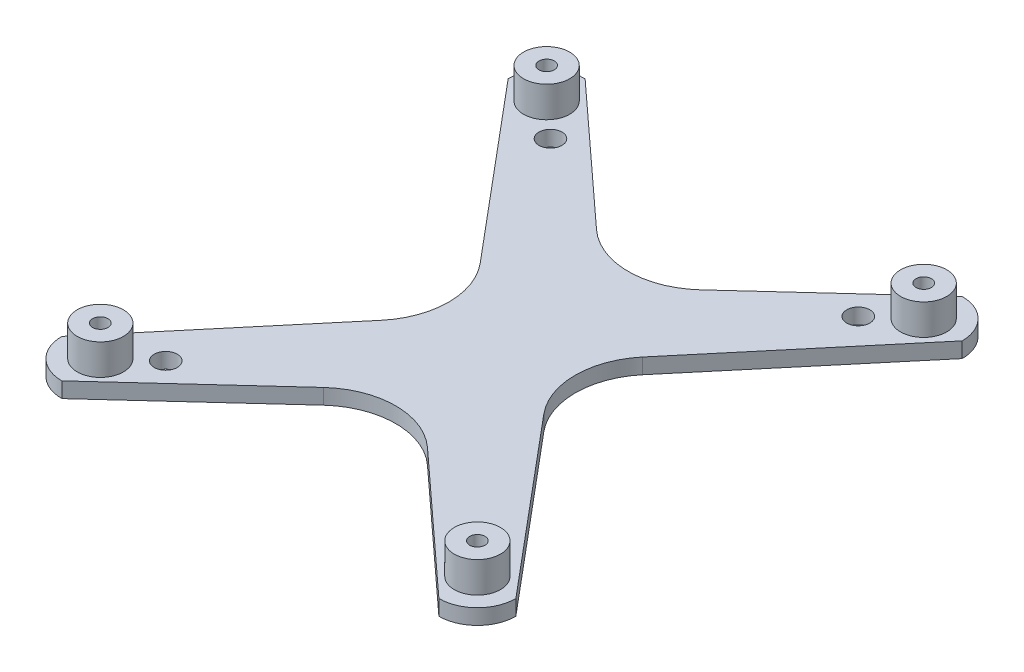
ISO-10303-21;
HEADER;
FILE_DESCRIPTION(('STEP AP214'),'2;1');
FILE_NAME('part.step','',(''),(''),'','','');
FILE_SCHEMA(('AUTOMOTIVE_DESIGN { 1 0 10303 214 1 1 1 1 }'));
ENDSEC;
DATA;
#1=APPLICATION_CONTEXT('core data for automotive mechanical design processes');
#2=APPLICATION_PROTOCOL_DEFINITION('international standard','automotive_design',2000,#1);
#3=PRODUCT_CONTEXT('',#1,'mechanical');
#4=PRODUCT('Part','Part','',(#3));
#5=PRODUCT_RELATED_PRODUCT_CATEGORY('part','',(#4));
#6=PRODUCT_DEFINITION_FORMATION('','',#4);
#7=PRODUCT_DEFINITION_CONTEXT('part definition',#1,'design');
#8=PRODUCT_DEFINITION('design','',#6,#7);
#9=PRODUCT_DEFINITION_SHAPE('','',#8);
#10=(LENGTH_UNIT() NAMED_UNIT(*) SI_UNIT(.MILLI.,.METRE.));
#11=(NAMED_UNIT(*) PLANE_ANGLE_UNIT() SI_UNIT($,.RADIAN.));
#12=(NAMED_UNIT(*) SI_UNIT($,.STERADIAN.) SOLID_ANGLE_UNIT());
#13=UNCERTAINTY_MEASURE_WITH_UNIT(LENGTH_MEASURE(1.E-05),#10,'distance_accuracy_value','');
#14=(GEOMETRIC_REPRESENTATION_CONTEXT(3) GLOBAL_UNCERTAINTY_ASSIGNED_CONTEXT((#13)) GLOBAL_UNIT_ASSIGNED_CONTEXT((#10,
#11,#12)) REPRESENTATION_CONTEXT('',''));
#15=CARTESIAN_POINT('',(0.,0.,0.));
#16=DIRECTION('',(0.,0.,1.));
#17=DIRECTION('',(1.,0.,0.));
#18=AXIS2_PLACEMENT_3D('',#15,#16,#17);
#19=CARTESIAN_POINT('',(0.,2.,0.));
#20=DIRECTION('',(0.,-1.,0.));
#21=DIRECTION('',(0.,0.,-1.));
#22=AXIS2_PLACEMENT_3D('',#19,#20,#21);
#23=PLANE('',#22);
#24=CARTESIAN_POINT('',(54.,2.,-5.));
#25=DIRECTION('',(0.,-1.,0.));
#26=DIRECTION('',(0.,0.,-1.));
#27=AXIS2_PLACEMENT_3D('',#24,#25,#26);
#28=CIRCLE('',#27,3.);
#29=CARTESIAN_POINT('',(54.,2.,-8.));
#30=VERTEX_POINT('',#29);
#31=EDGE_CURVE('E41',#30,#30,#28,.F.);
#32=ORIENTED_EDGE('',*,*,#31,.F.);
#33=EDGE_LOOP('',(#32));
#34=FACE_BOUND('',#33,.T.);
#35=CARTESIAN_POINT('',(9.49999999999998,2.,-8.99999999999999));
#36=DIRECTION('',(0.,1.,0.));
#37=DIRECTION('',(0.,0.,1.));
#38=AXIS2_PLACEMENT_3D('',#35,#36,#37);
#39=CIRCLE('',#38,1.5);
#40=CARTESIAN_POINT('',(9.49999999999998,2.,-7.5));
#41=VERTEX_POINT('',#40);
#42=EDGE_CURVE('E217',#41,#41,#39,.T.);
#43=ORIENTED_EDGE('',*,*,#42,.F.);
#44=EDGE_LOOP('',(#43));
#45=FACE_BOUND('',#44,.T.);
#46=CARTESIAN_POINT('',(49.5,2.,-8.99999999999999));
#47=DIRECTION('',(0.,1.,0.));
#48=DIRECTION('',(0.,0.,1.));
#49=AXIS2_PLACEMENT_3D('',#46,#47,#48);
#50=CIRCLE('',#49,1.5);
#51=CARTESIAN_POINT('',(49.5,2.,-7.49999999999999));
#52=VERTEX_POINT('',#51);
#53=EDGE_CURVE('E221',#52,#52,#50,.T.);
#54=ORIENTED_EDGE('',*,*,#53,.F.);
#55=EDGE_LOOP('',(#54));
#56=FACE_BOUND('',#55,.T.);
#57=CARTESIAN_POINT('',(9.49999999999997,2.,-59.));
#58=DIRECTION('',(0.,1.,0.));
#59=DIRECTION('',(0.,0.,1.));
#60=AXIS2_PLACEMENT_3D('',#57,#58,#59);
#61=CIRCLE('',#60,1.5);
#62=CARTESIAN_POINT('',(9.49999999999997,2.,-57.5));
#63=VERTEX_POINT('',#62);
#64=EDGE_CURVE('E225',#63,#63,#61,.T.);
#65=ORIENTED_EDGE('',*,*,#64,.F.);
#66=EDGE_LOOP('',(#65));
#67=FACE_BOUND('',#66,.T.);
#68=CARTESIAN_POINT('',(49.5,2.,-59.));
#69=DIRECTION('',(0.,1.,0.));
#70=DIRECTION('',(0.,0.,1.));
#71=AXIS2_PLACEMENT_3D('',#68,#69,#70);
#72=CIRCLE('',#71,1.5);
#73=CARTESIAN_POINT('',(49.5,2.,-57.5));
#74=VERTEX_POINT('',#73);
#75=EDGE_CURVE('E229',#74,#74,#72,.T.);
#76=ORIENTED_EDGE('',*,*,#75,.F.);
#77=EDGE_LOOP('',(#76));
#78=FACE_BOUND('',#77,.T.);
#79=CARTESIAN_POINT('',(5.,2.,-63.));
#80=DIRECTION('',(0.,-1.,0.));
#81=DIRECTION('',(0.,0.,-1.));
#82=AXIS2_PLACEMENT_3D('',#79,#80,#81);
#83=CIRCLE('',#82,5.);
#84=CARTESIAN_POINT('',(5.,2.,-68.));
#85=VERTEX_POINT('',#84);
#86=CARTESIAN_POINT('',(0.,2.,-63.));
#87=VERTEX_POINT('',#86);
#88=EDGE_CURVE('E197',#85,#87,#83,.F.);
#89=ORIENTED_EDGE('',*,*,#88,.T.);
#90=DIRECTION('',(-0.642787609686541,0.,-0.766044443118977));
#91=VECTOR('',#90,1.);
#92=CARTESIAN_POINT('',(18.9402608420081,2.,-40.4278760968655));
#93=LINE('',#92,#91);
#94=CARTESIAN_POINT('',(18.9402608420081,2.,-40.4278760968655));
#95=VERTEX_POINT('',#94);
#96=EDGE_CURVE('E394',#95,#87,#93,.T.);
#97=ORIENTED_EDGE('',*,*,#96,.F.);
#98=CARTESIAN_POINT('',(11.2798164108184,2.,-34.));
#99=DIRECTION('',(0.,1.,0.));
#100=DIRECTION('',(0.,0.,1.));
#101=AXIS2_PLACEMENT_3D('',#98,#99,#100);
#102=CIRCLE('',#101,10.);
#103=CARTESIAN_POINT('',(18.9402608420081,2.,-27.5721239031345));
#104=VERTEX_POINT('',#103);
#105=EDGE_CURVE('E402',#104,#95,#102,.T.);
#106=ORIENTED_EDGE('',*,*,#105,.F.);
#107=DIRECTION('',(0.642787609686541,0.,-0.766044443118977));
#108=VECTOR('',#107,1.);
#109=CARTESIAN_POINT('',(0.,2.,-5.));
#110=LINE('',#109,#108);
#111=CARTESIAN_POINT('',(0.,2.,-5.));
#112=VERTEX_POINT('',#111);
#113=EDGE_CURVE('E387',#112,#104,#110,.T.);
#114=ORIENTED_EDGE('',*,*,#113,.F.);
#115=CARTESIAN_POINT('',(5.,2.,-5.));
#116=DIRECTION('',(0.,-1.,0.));
#117=DIRECTION('',(0.,0.,-1.));
#118=AXIS2_PLACEMENT_3D('',#115,#116,#117);
#119=CIRCLE('',#118,5.);
#120=CARTESIAN_POINT('',(5.,2.,0.));
#121=VERTEX_POINT('',#120);
#122=EDGE_CURVE('E194',#112,#121,#119,.F.);
#123=ORIENTED_EDGE('',*,*,#122,.T.);
#124=DIRECTION('',(-0.737277336810123,0.,0.675590207615661));
#125=VECTOR('',#124,1.);
#126=CARTESIAN_POINT('',(22.7440979238434,2.,-16.2594700824356));
#127=LINE('',#126,#125);
#128=CARTESIAN_POINT('',(22.7440979238434,2.,-16.2594700824356));
#129=VERTEX_POINT('',#128);
#130=EDGE_CURVE('E422',#129,#121,#127,.T.);
#131=ORIENTED_EDGE('',*,*,#130,.F.);
#132=CARTESIAN_POINT('',(29.5,2.,-8.88669671433437));
#133=DIRECTION('',(0.,1.,0.));
#134=DIRECTION('',(0.,0.,1.));
#135=AXIS2_PLACEMENT_3D('',#132,#133,#134);
#136=CIRCLE('',#135,10.);
#137=CARTESIAN_POINT('',(36.2559020761567,2.,-16.2594700824356));
#138=VERTEX_POINT('',#137);
#139=EDGE_CURVE('E408',#138,#129,#136,.T.);
#140=ORIENTED_EDGE('',*,*,#139,.F.);
#141=DIRECTION('',(-0.737277336810122,0.,-0.675590207615662));
#142=VECTOR('',#141,1.);
#143=CARTESIAN_POINT('',(54.,2.,0.));
#144=LINE('',#143,#142);
#145=CARTESIAN_POINT('',(54.,2.,0.));
#146=VERTEX_POINT('',#145);
#147=EDGE_CURVE('E414',#146,#138,#144,.T.);
#148=ORIENTED_EDGE('',*,*,#147,.F.);
#149=CARTESIAN_POINT('',(54.,2.,-5.));
#150=DIRECTION('',(0.,-1.,0.));
#151=DIRECTION('',(0.,0.,-1.));
#152=AXIS2_PLACEMENT_3D('',#149,#150,#151);
#153=CIRCLE('',#152,5.);
#154=CARTESIAN_POINT('',(59.,2.,-5.));
#155=VERTEX_POINT('',#154);
#156=EDGE_CURVE('E190',#146,#155,#153,.F.);
#157=ORIENTED_EDGE('',*,*,#156,.T.);
#158=DIRECTION('',(0.642787609686541,0.,0.766044443118977));
#159=VECTOR('',#158,1.);
#160=CARTESIAN_POINT('',(59.,2.,-5.));
#161=LINE('',#160,#159);
#162=CARTESIAN_POINT('',(40.0597391579919,2.,-27.5721239031345));
#163=VERTEX_POINT('',#162);
#164=EDGE_CURVE('E48',#163,#155,#161,.T.);
#165=ORIENTED_EDGE('',*,*,#164,.F.);
#166=CARTESIAN_POINT('',(47.7201835891816,2.,-34.));
#167=DIRECTION('',(0.,1.,0.));
#168=DIRECTION('',(0.,0.,-1.));
#169=AXIS2_PLACEMENT_3D('',#166,#167,#168);
#170=CIRCLE('',#169,10.);
#171=CARTESIAN_POINT('',(40.0597391579919,2.,-40.4278760968655));
#172=VERTEX_POINT('',#171);
#173=EDGE_CURVE('E168',#172,#163,#170,.T.);
#174=ORIENTED_EDGE('',*,*,#173,.F.);
#175=DIRECTION('',(-0.642787609686541,0.,0.766044443118977));
#176=VECTOR('',#175,1.);
#177=CARTESIAN_POINT('',(40.0597391579919,2.,-40.4278760968655));
#178=LINE('',#177,#176);
#179=CARTESIAN_POINT('',(59.,2.,-63.));
#180=VERTEX_POINT('',#179);
#181=EDGE_CURVE('E377',#180,#172,#178,.T.);
#182=ORIENTED_EDGE('',*,*,#181,.F.);
#183=CARTESIAN_POINT('',(54.,2.,-63.));
#184=DIRECTION('',(0.,-1.,0.));
#185=DIRECTION('',(0.,0.,-1.));
#186=AXIS2_PLACEMENT_3D('',#183,#184,#185);
#187=CIRCLE('',#186,5.);
#188=CARTESIAN_POINT('',(54.,2.,-68.));
#189=VERTEX_POINT('',#188);
#190=EDGE_CURVE('E192',#180,#189,#187,.F.);
#191=ORIENTED_EDGE('',*,*,#190,.T.);
#192=DIRECTION('',(0.737277336810123,0.,-0.675590207615661));
#193=VECTOR('',#192,1.);
#194=CARTESIAN_POINT('',(54.,2.,-68.));
#195=LINE('',#194,#193);
#196=CARTESIAN_POINT('',(36.2559020761567,2.,-51.7405299175645));
#197=VERTEX_POINT('',#196);
#198=EDGE_CURVE('E56',#197,#189,#195,.T.);
#199=ORIENTED_EDGE('',*,*,#198,.F.);
#200=CARTESIAN_POINT('',(29.5,2.,-59.1133032856657));
#201=DIRECTION('',(0.,1.,0.));
#202=DIRECTION('',(0.,0.,-1.));
#203=AXIS2_PLACEMENT_3D('',#200,#201,#202);
#204=CIRCLE('',#203,10.);
#205=CARTESIAN_POINT('',(22.7440979238434,2.,-51.7405299175645));
#206=VERTEX_POINT('',#205);
#207=EDGE_CURVE('E433',#206,#197,#204,.T.);
#208=ORIENTED_EDGE('',*,*,#207,.F.);
#209=DIRECTION('',(0.737277336810123,0.,0.675590207615661));
#210=VECTOR('',#209,1.);
#211=CARTESIAN_POINT('',(22.7440979238434,2.,-51.7405299175645));
#212=LINE('',#211,#210);
#213=EDGE_CURVE('E441',#85,#206,#212,.T.);
#214=ORIENTED_EDGE('',*,*,#213,.F.);
#215=EDGE_LOOP('',(#89,#97,#106,#114,#123,#131,#140,#148,#157,#165,#174,#182,#191,#199,#208,#214));
#216=FACE_BOUND('',#215,.T.);
#217=CARTESIAN_POINT('',(4.99999999999999,2.,-63.));
#218=DIRECTION('',(0.,1.,0.));
#219=DIRECTION('',(0.,0.,1.));
#220=AXIS2_PLACEMENT_3D('',#217,#218,#219);
#221=CIRCLE('',#220,3.);
#222=CARTESIAN_POINT('',(4.99999999999999,2.,-60.));
#223=VERTEX_POINT('',#222);
#224=EDGE_CURVE('E203',#223,#223,#221,.T.);
#225=ORIENTED_EDGE('',*,*,#224,.F.);
#226=EDGE_LOOP('',(#225));
#227=FACE_BOUND('',#226,.T.);
#228=CARTESIAN_POINT('',(54.,2.,-63.));
#229=DIRECTION('',(0.,-1.,0.));
#230=DIRECTION('',(0.,0.,-1.));
#231=AXIS2_PLACEMENT_3D('',#228,#229,#230);
#232=CIRCLE('',#231,3.);
#233=CARTESIAN_POINT('',(54.,2.,-66.));
#234=VERTEX_POINT('',#233);
#235=EDGE_CURVE('E204',#234,#234,#232,.F.);
#236=ORIENTED_EDGE('',*,*,#235,.F.);
#237=EDGE_LOOP('',(#236));
#238=FACE_BOUND('',#237,.T.);
#239=CARTESIAN_POINT('',(4.99999999999999,2.,-5.));
#240=DIRECTION('',(0.,-1.,0.));
#241=DIRECTION('',(0.,0.,-1.));
#242=AXIS2_PLACEMENT_3D('',#239,#240,#241);
#243=CIRCLE('',#242,3.);
#244=CARTESIAN_POINT('',(4.99999999999999,2.,-8.));
#245=VERTEX_POINT('',#244);
#246=EDGE_CURVE('E11',#245,#245,#243,.F.);
#247=ORIENTED_EDGE('',*,*,#246,.F.);
#248=EDGE_LOOP('',(#247));
#249=FACE_BOUND('',#248,.T.);
#250=ADVANCED_FACE('F33',(#34,#45,#56,#67,#78,#216,#227,#238,#249),#23,.F.);
#251=CARTESIAN_POINT('',(0.,0.,0.));
#252=DIRECTION('',(0.,-1.,0.));
#253=DIRECTION('',(0.,0.,-1.));
#254=AXIS2_PLACEMENT_3D('',#251,#252,#253);
#255=PLANE('',#254);
#256=DIRECTION('',(-0.642787609686541,0.,-0.766044443118977));
#257=VECTOR('',#256,1.);
#258=CARTESIAN_POINT('',(18.9402608420081,0.,-40.4278760968655));
#259=LINE('',#258,#257);
#260=CARTESIAN_POINT('',(18.9402608420081,0.,-40.4278760968655));
#261=VERTEX_POINT('',#260);
#262=CARTESIAN_POINT('',(0.,0.,-63.));
#263=VERTEX_POINT('',#262);
#264=EDGE_CURVE('E397',#261,#263,#259,.T.);
#265=ORIENTED_EDGE('',*,*,#264,.T.);
#266=CARTESIAN_POINT('',(5.,0.,-63.));
#267=DIRECTION('',(0.,-1.,0.));
#268=DIRECTION('',(0.,0.,-1.));
#269=AXIS2_PLACEMENT_3D('',#266,#267,#268);
#270=CIRCLE('',#269,5.);
#271=CARTESIAN_POINT('',(5.,0.,-68.));
#272=VERTEX_POINT('',#271);
#273=EDGE_CURVE('E183',#263,#272,#270,.T.);
#274=ORIENTED_EDGE('',*,*,#273,.T.);
#275=DIRECTION('',(0.737277336810123,0.,0.675590207615661));
#276=VECTOR('',#275,1.);
#277=CARTESIAN_POINT('',(22.7440979238434,0.,-51.7405299175645));
#278=LINE('',#277,#276);
#279=CARTESIAN_POINT('',(22.7440979238434,0.,-51.7405299175645));
#280=VERTEX_POINT('',#279);
#281=EDGE_CURVE('E432',#272,#280,#278,.T.);
#282=ORIENTED_EDGE('',*,*,#281,.T.);
#283=CARTESIAN_POINT('',(29.5,0.,-59.1133032856657));
#284=DIRECTION('',(0.,1.,0.));
#285=DIRECTION('',(0.,0.,-1.));
#286=AXIS2_PLACEMENT_3D('',#283,#284,#285);
#287=CIRCLE('',#286,10.);
#288=CARTESIAN_POINT('',(36.2559020761567,0.,-51.7405299175645));
#289=VERTEX_POINT('',#288);
#290=EDGE_CURVE('E436',#280,#289,#287,.T.);
#291=ORIENTED_EDGE('',*,*,#290,.T.);
#292=DIRECTION('',(0.737277336810123,0.,-0.675590207615661));
#293=VECTOR('',#292,1.);
#294=CARTESIAN_POINT('',(54.,0.,-68.));
#295=LINE('',#294,#293);
#296=CARTESIAN_POINT('',(54.,0.,-68.));
#297=VERTEX_POINT('',#296);
#298=EDGE_CURVE('E429',#289,#297,#295,.T.);
#299=ORIENTED_EDGE('',*,*,#298,.T.);
#300=CARTESIAN_POINT('',(54.,0.,-63.));
#301=DIRECTION('',(0.,-1.,0.));
#302=DIRECTION('',(0.,0.,-1.));
#303=AXIS2_PLACEMENT_3D('',#300,#301,#302);
#304=CIRCLE('',#303,5.);
#305=CARTESIAN_POINT('',(59.,0.,-63.));
#306=VERTEX_POINT('',#305);
#307=EDGE_CURVE('E171',#297,#306,#304,.T.);
#308=ORIENTED_EDGE('',*,*,#307,.T.);
#309=DIRECTION('',(-0.642787609686541,0.,0.766044443118977));
#310=VECTOR('',#309,1.);
#311=CARTESIAN_POINT('',(40.0597391579919,0.,-40.4278760968655));
#312=LINE('',#311,#310);
#313=CARTESIAN_POINT('',(40.0597391579919,0.,-40.4278760968655));
#314=VERTEX_POINT('',#313);
#315=EDGE_CURVE('E167',#306,#314,#312,.T.);
#316=ORIENTED_EDGE('',*,*,#315,.T.);
#317=CARTESIAN_POINT('',(47.7201835891816,0.,-34.));
#318=DIRECTION('',(0.,1.,0.));
#319=DIRECTION('',(0.,0.,-1.));
#320=AXIS2_PLACEMENT_3D('',#317,#318,#319);
#321=CIRCLE('',#320,10.);
#322=CARTESIAN_POINT('',(40.0597391579919,0.,-27.5721239031345));
#323=VERTEX_POINT('',#322);
#324=EDGE_CURVE('E166',#314,#323,#321,.T.);
#325=ORIENTED_EDGE('',*,*,#324,.T.);
#326=DIRECTION('',(0.642787609686541,0.,0.766044443118977));
#327=VECTOR('',#326,1.);
#328=CARTESIAN_POINT('',(59.,0.,-5.));
#329=LINE('',#328,#327);
#330=CARTESIAN_POINT('',(59.,0.,-5.));
#331=VERTEX_POINT('',#330);
#332=EDGE_CURVE('E148',#323,#331,#329,.T.);
#333=ORIENTED_EDGE('',*,*,#332,.T.);
#334=CARTESIAN_POINT('',(54.,0.,-5.));
#335=DIRECTION('',(0.,-1.,0.));
#336=DIRECTION('',(0.,0.,-1.));
#337=AXIS2_PLACEMENT_3D('',#334,#335,#336);
#338=CIRCLE('',#337,5.);
#339=CARTESIAN_POINT('',(54.,0.,0.));
#340=VERTEX_POINT('',#339);
#341=EDGE_CURVE('E162',#331,#340,#338,.T.);
#342=ORIENTED_EDGE('',*,*,#341,.T.);
#343=DIRECTION('',(-0.737277336810122,0.,-0.675590207615662));
#344=VECTOR('',#343,1.);
#345=CARTESIAN_POINT('',(54.,0.,0.));
#346=LINE('',#345,#344);
#347=CARTESIAN_POINT('',(36.2559020761567,0.,-16.2594700824356));
#348=VERTEX_POINT('',#347);
#349=EDGE_CURVE('E417',#340,#348,#346,.T.);
#350=ORIENTED_EDGE('',*,*,#349,.T.);
#351=CARTESIAN_POINT('',(29.5,0.,-8.88669671433437));
#352=DIRECTION('',(0.,1.,0.));
#353=DIRECTION('',(0.,0.,1.));
#354=AXIS2_PLACEMENT_3D('',#351,#352,#353);
#355=CIRCLE('',#354,10.);
#356=CARTESIAN_POINT('',(22.7440979238434,0.,-16.2594700824356));
#357=VERTEX_POINT('',#356);
#358=EDGE_CURVE('E410',#348,#357,#355,.T.);
#359=ORIENTED_EDGE('',*,*,#358,.T.);
#360=DIRECTION('',(-0.737277336810123,0.,0.675590207615661));
#361=VECTOR('',#360,1.);
#362=CARTESIAN_POINT('',(22.7440979238434,0.,-16.2594700824356));
#363=LINE('',#362,#361);
#364=CARTESIAN_POINT('',(5.,0.,0.));
#365=VERTEX_POINT('',#364);
#366=EDGE_CURVE('E413',#357,#365,#363,.T.);
#367=ORIENTED_EDGE('',*,*,#366,.T.);
#368=CARTESIAN_POINT('',(5.,0.,-5.));
#369=DIRECTION('',(0.,-1.,0.));
#370=DIRECTION('',(0.,0.,-1.));
#371=AXIS2_PLACEMENT_3D('',#368,#369,#370);
#372=CIRCLE('',#371,5.);
#373=CARTESIAN_POINT('',(0.,0.,-5.));
#374=VERTEX_POINT('',#373);
#375=EDGE_CURVE('E175',#365,#374,#372,.T.);
#376=ORIENTED_EDGE('',*,*,#375,.T.);
#377=DIRECTION('',(0.642787609686541,0.,-0.766044443118977));
#378=VECTOR('',#377,1.);
#379=CARTESIAN_POINT('',(0.,0.,-5.));
#380=LINE('',#379,#378);
#381=CARTESIAN_POINT('',(18.9402608420081,0.,-27.5721239031345));
#382=VERTEX_POINT('',#381);
#383=EDGE_CURVE('E390',#374,#382,#380,.T.);
#384=ORIENTED_EDGE('',*,*,#383,.T.);
#385=CARTESIAN_POINT('',(11.2798164108184,0.,-34.));
#386=DIRECTION('',(0.,1.,0.));
#387=DIRECTION('',(0.,0.,1.));
#388=AXIS2_PLACEMENT_3D('',#385,#386,#387);
#389=CIRCLE('',#388,10.);
#390=EDGE_CURVE('E393',#382,#261,#389,.T.);
#391=ORIENTED_EDGE('',*,*,#390,.T.);
#392=EDGE_LOOP('',(#265,#274,#282,#291,#299,#308,#316,#325,#333,#342,#350,#359,#367,#376,#384,#391));
#393=FACE_BOUND('',#392,.T.);
#394=CARTESIAN_POINT('',(49.5,0.,-8.99999999999999));
#395=DIRECTION('',(0.,1.,0.));
#396=DIRECTION('',(0.,0.,1.));
#397=AXIS2_PLACEMENT_3D('',#394,#395,#396);
#398=CIRCLE('',#397,1.5);
#399=CARTESIAN_POINT('',(49.5,0.,-7.49999999999999));
#400=VERTEX_POINT('',#399);
#401=EDGE_CURVE('E451',#400,#400,#398,.T.);
#402=ORIENTED_EDGE('',*,*,#401,.T.);
#403=EDGE_LOOP('',(#402));
#404=FACE_BOUND('',#403,.T.);
#405=CARTESIAN_POINT('',(49.5,0.,-59.));
#406=DIRECTION('',(0.,1.,0.));
#407=DIRECTION('',(0.,0.,1.));
#408=AXIS2_PLACEMENT_3D('',#405,#406,#407);
#409=CIRCLE('',#408,1.5);
#410=CARTESIAN_POINT('',(49.5,0.,-57.5));
#411=VERTEX_POINT('',#410);
#412=EDGE_CURVE('E459',#411,#411,#409,.T.);
#413=ORIENTED_EDGE('',*,*,#412,.T.);
#414=EDGE_LOOP('',(#413));
#415=FACE_BOUND('',#414,.T.);
#416=CARTESIAN_POINT('',(4.99999999999999,0.,-63.));
#417=DIRECTION('',(0.,1.,0.));
#418=DIRECTION('',(0.,0.,1.));
#419=AXIS2_PLACEMENT_3D('',#416,#417,#418);
#420=CIRCLE('',#419,1.);
#421=CARTESIAN_POINT('',(4.99999999999999,0.,-62.));
#422=VERTEX_POINT('',#421);
#423=EDGE_CURVE('E468',#422,#422,#420,.T.);
#424=ORIENTED_EDGE('',*,*,#423,.T.);
#425=EDGE_LOOP('',(#424));
#426=FACE_BOUND('',#425,.T.);
#427=CARTESIAN_POINT('',(4.99999999999999,0.,-5.));
#428=DIRECTION('',(0.,1.,0.));
#429=DIRECTION('',(0.,0.,1.));
#430=AXIS2_PLACEMENT_3D('',#427,#428,#429);
#431=CIRCLE('',#430,1.);
#432=CARTESIAN_POINT('',(4.99999999999999,0.,-4.));
#433=VERTEX_POINT('',#432);
#434=EDGE_CURVE('E474',#433,#433,#431,.T.);
#435=ORIENTED_EDGE('',*,*,#434,.T.);
#436=EDGE_LOOP('',(#435));
#437=FACE_BOUND('',#436,.T.);
#438=CARTESIAN_POINT('',(54.,0.,-5.));
#439=DIRECTION('',(0.,1.,0.));
#440=DIRECTION('',(0.,0.,1.));
#441=AXIS2_PLACEMENT_3D('',#438,#439,#440);
#442=CIRCLE('',#441,0.999999999999998);
#443=CARTESIAN_POINT('',(54.,0.,-4.));
#444=VERTEX_POINT('',#443);
#445=EDGE_CURVE('E471',#444,#444,#442,.T.);
#446=ORIENTED_EDGE('',*,*,#445,.T.);
#447=EDGE_LOOP('',(#446));
#448=FACE_BOUND('',#447,.T.);
#449=CARTESIAN_POINT('',(54.,0.,-63.));
#450=DIRECTION('',(0.,1.,0.));
#451=DIRECTION('',(0.,0.,1.));
#452=AXIS2_PLACEMENT_3D('',#449,#450,#451);
#453=CIRCLE('',#452,0.999999999999998);
#454=CARTESIAN_POINT('',(54.,0.,-62.));
#455=VERTEX_POINT('',#454);
#456=EDGE_CURVE('E463',#455,#455,#453,.T.);
#457=ORIENTED_EDGE('',*,*,#456,.T.);
#458=EDGE_LOOP('',(#457));
#459=FACE_BOUND('',#458,.T.);
#460=CARTESIAN_POINT('',(9.49999999999997,0.,-59.));
#461=DIRECTION('',(0.,1.,0.));
#462=DIRECTION('',(0.,0.,1.));
#463=AXIS2_PLACEMENT_3D('',#460,#461,#462);
#464=CIRCLE('',#463,1.5);
#465=CARTESIAN_POINT('',(9.49999999999997,0.,-57.5));
#466=VERTEX_POINT('',#465);
#467=EDGE_CURVE('E455',#466,#466,#464,.T.);
#468=ORIENTED_EDGE('',*,*,#467,.T.);
#469=EDGE_LOOP('',(#468));
#470=FACE_BOUND('',#469,.T.);
#471=CARTESIAN_POINT('',(9.49999999999998,0.,-8.99999999999999));
#472=DIRECTION('',(0.,1.,0.));
#473=DIRECTION('',(0.,0.,1.));
#474=AXIS2_PLACEMENT_3D('',#471,#472,#473);
#475=CIRCLE('',#474,1.5);
#476=CARTESIAN_POINT('',(9.49999999999998,0.,-7.5));
#477=VERTEX_POINT('',#476);
#478=EDGE_CURVE('E448',#477,#477,#475,.T.);
#479=ORIENTED_EDGE('',*,*,#478,.T.);
#480=EDGE_LOOP('',(#479));
#481=FACE_BOUND('',#480,.T.);
#482=ADVANCED_FACE('F159',(#393,#404,#415,#426,#437,#448,#459,#470,#481),#255,.T.);
#483=CARTESIAN_POINT('',(4.99999999999999,2.,-5.));
#484=DIRECTION('',(0.,-1.,0.));
#485=DIRECTION('',(0.,0.,-1.));
#486=AXIS2_PLACEMENT_3D('',#483,#484,#485);
#487=CYLINDRICAL_SURFACE('',#486,1.);
#488=ORIENTED_EDGE('',*,*,#434,.F.);
#489=EDGE_LOOP('',(#488));
#490=FACE_BOUND('',#489,.T.);
#491=CARTESIAN_POINT('',(4.99999999999999,6.,-5.));
#492=DIRECTION('',(0.,1.,0.));
#493=DIRECTION('',(0.,0.,1.));
#494=AXIS2_PLACEMENT_3D('',#491,#492,#493);
#495=CIRCLE('',#494,1.);
#496=CARTESIAN_POINT('',(4.99999999999999,6.,-4.));
#497=VERTEX_POINT('',#496);
#498=EDGE_CURVE('E516',#497,#497,#495,.T.);
#499=ORIENTED_EDGE('',*,*,#498,.T.);
#500=EDGE_LOOP('',(#499));
#501=FACE_BOUND('',#500,.T.);
#502=ADVANCED_FACE('F350',(#490,#501),#487,.F.);
#503=CARTESIAN_POINT('',(54.,2.,-5.));
#504=DIRECTION('',(0.,-1.,0.));
#505=DIRECTION('',(0.,0.,-1.));
#506=AXIS2_PLACEMENT_3D('',#503,#504,#505);
#507=CYLINDRICAL_SURFACE('',#506,0.999999999999998);
#508=ORIENTED_EDGE('',*,*,#445,.F.);
#509=EDGE_LOOP('',(#508));
#510=FACE_BOUND('',#509,.T.);
#511=CARTESIAN_POINT('',(54.,6.,-5.));
#512=DIRECTION('',(0.,1.,0.));
#513=DIRECTION('',(0.,0.,1.));
#514=AXIS2_PLACEMENT_3D('',#511,#512,#513);
#515=CIRCLE('',#514,0.999999999999998);
#516=CARTESIAN_POINT('',(54.,6.,-4.));
#517=VERTEX_POINT('',#516);
#518=EDGE_CURVE('E510',#517,#517,#515,.T.);
#519=ORIENTED_EDGE('',*,*,#518,.T.);
#520=EDGE_LOOP('',(#519));
#521=FACE_BOUND('',#520,.T.);
#522=ADVANCED_FACE('F346',(#510,#521),#507,.F.);
#523=CARTESIAN_POINT('',(4.99999999999999,2.,-63.));
#524=DIRECTION('',(0.,-1.,0.));
#525=DIRECTION('',(0.,0.,-1.));
#526=AXIS2_PLACEMENT_3D('',#523,#524,#525);
#527=CYLINDRICAL_SURFACE('',#526,1.);
#528=ORIENTED_EDGE('',*,*,#423,.F.);
#529=EDGE_LOOP('',(#528));
#530=FACE_BOUND('',#529,.T.);
#531=CARTESIAN_POINT('',(4.99999999999999,6.,-63.));
#532=DIRECTION('',(0.,1.,0.));
#533=DIRECTION('',(0.,0.,1.));
#534=AXIS2_PLACEMENT_3D('',#531,#532,#533);
#535=CIRCLE('',#534,1.);
#536=CARTESIAN_POINT('',(4.99999999999999,6.,-62.));
#537=VERTEX_POINT('',#536);
#538=EDGE_CURVE('E498',#537,#537,#535,.T.);
#539=ORIENTED_EDGE('',*,*,#538,.T.);
#540=EDGE_LOOP('',(#539));
#541=FACE_BOUND('',#540,.T.);
#542=ADVANCED_FACE('F342',(#530,#541),#527,.F.);
#543=CARTESIAN_POINT('',(54.,2.,-63.));
#544=DIRECTION('',(0.,-1.,0.));
#545=DIRECTION('',(0.,0.,-1.));
#546=AXIS2_PLACEMENT_3D('',#543,#544,#545);
#547=CYLINDRICAL_SURFACE('',#546,0.999999999999998);
#548=ORIENTED_EDGE('',*,*,#456,.F.);
#549=EDGE_LOOP('',(#548));
#550=FACE_BOUND('',#549,.T.);
#551=CARTESIAN_POINT('',(54.,6.,-63.));
#552=DIRECTION('',(0.,1.,0.));
#553=DIRECTION('',(0.,0.,1.));
#554=AXIS2_PLACEMENT_3D('',#551,#552,#553);
#555=CIRCLE('',#554,0.999999999999998);
#556=CARTESIAN_POINT('',(54.,6.,-62.));
#557=VERTEX_POINT('',#556);
#558=EDGE_CURVE('E504',#557,#557,#555,.T.);
#559=ORIENTED_EDGE('',*,*,#558,.T.);
#560=EDGE_LOOP('',(#559));
#561=FACE_BOUND('',#560,.T.);
#562=ADVANCED_FACE('F338',(#550,#561),#547,.F.);
#563=CARTESIAN_POINT('',(49.5,2.,-59.));
#564=DIRECTION('',(0.,-1.,0.));
#565=DIRECTION('',(0.,0.,-1.));
#566=AXIS2_PLACEMENT_3D('',#563,#564,#565);
#567=CYLINDRICAL_SURFACE('',#566,1.5);
#568=ORIENTED_EDGE('',*,*,#75,.T.);
#569=EDGE_LOOP('',(#568));
#570=FACE_BOUND('',#569,.T.);
#571=ORIENTED_EDGE('',*,*,#412,.F.);
#572=EDGE_LOOP('',(#571));
#573=FACE_BOUND('',#572,.T.);
#574=ADVANCED_FACE('F334',(#570,#573),#567,.F.);
#575=CARTESIAN_POINT('',(9.49999999999997,2.,-59.));
#576=DIRECTION('',(0.,-1.,0.));
#577=DIRECTION('',(0.,0.,-1.));
#578=AXIS2_PLACEMENT_3D('',#575,#576,#577);
#579=CYLINDRICAL_SURFACE('',#578,1.5);
#580=ORIENTED_EDGE('',*,*,#64,.T.);
#581=EDGE_LOOP('',(#580));
#582=FACE_BOUND('',#581,.T.);
#583=ORIENTED_EDGE('',*,*,#467,.F.);
#584=EDGE_LOOP('',(#583));
#585=FACE_BOUND('',#584,.T.);
#586=ADVANCED_FACE('F330',(#582,#585),#579,.F.);
#587=CARTESIAN_POINT('',(49.5,2.,-8.99999999999999));
#588=DIRECTION('',(0.,-1.,0.));
#589=DIRECTION('',(0.,0.,-1.));
#590=AXIS2_PLACEMENT_3D('',#587,#588,#589);
#591=CYLINDRICAL_SURFACE('',#590,1.5);
#592=ORIENTED_EDGE('',*,*,#53,.T.);
#593=EDGE_LOOP('',(#592));
#594=FACE_BOUND('',#593,.T.);
#595=ORIENTED_EDGE('',*,*,#401,.F.);
#596=EDGE_LOOP('',(#595));
#597=FACE_BOUND('',#596,.T.);
#598=ADVANCED_FACE('F326',(#594,#597),#591,.F.);
#599=CARTESIAN_POINT('',(9.49999999999998,2.,-8.99999999999999));
#600=DIRECTION('',(0.,-1.,0.));
#601=DIRECTION('',(0.,0.,-1.));
#602=AXIS2_PLACEMENT_3D('',#599,#600,#601);
#603=CYLINDRICAL_SURFACE('',#602,1.5);
#604=ORIENTED_EDGE('',*,*,#42,.T.);
#605=EDGE_LOOP('',(#604));
#606=FACE_BOUND('',#605,.T.);
#607=ORIENTED_EDGE('',*,*,#478,.F.);
#608=EDGE_LOOP('',(#607));
#609=FACE_BOUND('',#608,.T.);
#610=ADVANCED_FACE('F322',(#606,#609),#603,.F.);
#611=CARTESIAN_POINT('',(5.,2.,-63.));
#612=DIRECTION('',(0.,-1.,0.));
#613=DIRECTION('',(0.,0.,-1.));
#614=AXIS2_PLACEMENT_3D('',#611,#612,#613);
#615=CYLINDRICAL_SURFACE('',#614,5.);
#616=ORIENTED_EDGE('',*,*,#88,.F.);
#617=DIRECTION('',(0.,-1.,0.));
#618=VECTOR('',#617,1.);
#619=CARTESIAN_POINT('',(5.,2.,-68.));
#620=LINE('',#619,#618);
#621=EDGE_CURVE('E188',#272,#85,#620,.F.);
#622=ORIENTED_EDGE('',*,*,#621,.F.);
#623=ORIENTED_EDGE('',*,*,#273,.F.);
#624=DIRECTION('',(0.,-1.,0.));
#625=VECTOR('',#624,1.);
#626=CARTESIAN_POINT('',(0.,2.,-63.));
#627=LINE('',#626,#625);
#628=EDGE_CURVE('E172',#87,#263,#627,.T.);
#629=ORIENTED_EDGE('',*,*,#628,.F.);
#630=EDGE_LOOP('',(#616,#622,#623,#629));
#631=FACE_BOUND('',#630,.T.);
#632=ADVANCED_FACE('F325',(#631),#615,.T.);
#633=CARTESIAN_POINT('',(5.,2.,-5.));
#634=DIRECTION('',(0.,-1.,0.));
#635=DIRECTION('',(0.,0.,-1.));
#636=AXIS2_PLACEMENT_3D('',#633,#634,#635);
#637=CYLINDRICAL_SURFACE('',#636,5.);
#638=ORIENTED_EDGE('',*,*,#122,.F.);
#639=DIRECTION('',(0.,-1.,0.));
#640=VECTOR('',#639,1.);
#641=CARTESIAN_POINT('',(0.,2.,-5.));
#642=LINE('',#641,#640);
#643=EDGE_CURVE('E177',#374,#112,#642,.F.);
#644=ORIENTED_EDGE('',*,*,#643,.F.);
#645=ORIENTED_EDGE('',*,*,#375,.F.);
#646=DIRECTION('',(0.,-1.,0.));
#647=VECTOR('',#646,1.);
#648=CARTESIAN_POINT('',(5.,2.,0.));
#649=LINE('',#648,#647);
#650=EDGE_CURVE('E154',#121,#365,#649,.T.);
#651=ORIENTED_EDGE('',*,*,#650,.F.);
#652=EDGE_LOOP('',(#638,#644,#645,#651));
#653=FACE_BOUND('',#652,.T.);
#654=ADVANCED_FACE('F359',(#653),#637,.T.);
#655=CARTESIAN_POINT('',(54.,2.,-63.));
#656=DIRECTION('',(0.,-1.,0.));
#657=DIRECTION('',(0.,0.,-1.));
#658=AXIS2_PLACEMENT_3D('',#655,#656,#657);
#659=CYLINDRICAL_SURFACE('',#658,5.);
#660=ORIENTED_EDGE('',*,*,#190,.F.);
#661=DIRECTION('',(0.,-1.,0.));
#662=VECTOR('',#661,1.);
#663=CARTESIAN_POINT('',(59.,2.,-63.));
#664=LINE('',#663,#662);
#665=EDGE_CURVE('E153',#306,#180,#664,.F.);
#666=ORIENTED_EDGE('',*,*,#665,.F.);
#667=ORIENTED_EDGE('',*,*,#307,.F.);
#668=DIRECTION('',(0.,-1.,0.));
#669=VECTOR('',#668,1.);
#670=CARTESIAN_POINT('',(54.,2.,-68.));
#671=LINE('',#670,#669);
#672=EDGE_CURVE('E186',#189,#297,#671,.T.);
#673=ORIENTED_EDGE('',*,*,#672,.F.);
#674=EDGE_LOOP('',(#660,#666,#667,#673));
#675=FACE_BOUND('',#674,.T.);
#676=ADVANCED_FACE('F362',(#675),#659,.T.);
#677=CARTESIAN_POINT('',(54.,2.,-5.));
#678=DIRECTION('',(0.,-1.,0.));
#679=DIRECTION('',(0.,0.,-1.));
#680=AXIS2_PLACEMENT_3D('',#677,#678,#679);
#681=CYLINDRICAL_SURFACE('',#680,5.);
#682=ORIENTED_EDGE('',*,*,#156,.F.);
#683=DIRECTION('',(0.,-1.,0.));
#684=VECTOR('',#683,1.);
#685=CARTESIAN_POINT('',(54.,2.,0.));
#686=LINE('',#685,#684);
#687=EDGE_CURVE('E170',#340,#146,#686,.F.);
#688=ORIENTED_EDGE('',*,*,#687,.F.);
#689=ORIENTED_EDGE('',*,*,#341,.F.);
#690=DIRECTION('',(0.,-1.,0.));
#691=VECTOR('',#690,1.);
#692=CARTESIAN_POINT('',(59.,2.,-5.));
#693=LINE('',#692,#691);
#694=EDGE_CURVE('E145',#155,#331,#693,.T.);
#695=ORIENTED_EDGE('',*,*,#694,.F.);
#696=EDGE_LOOP('',(#682,#688,#689,#695));
#697=FACE_BOUND('',#696,.T.);
#698=ADVANCED_FACE('F35',(#697),#681,.T.);
#699=CARTESIAN_POINT('',(59.,0.,-5.));
#700=DIRECTION('',(-0.766044443118977,0.,0.642787609686541));
#701=DIRECTION('',(0.642787609686541,0.,0.766044443118977));
#702=AXIS2_PLACEMENT_3D('',#699,#700,#701);
#703=PLANE('',#702);
#704=ORIENTED_EDGE('',*,*,#164,.T.);
#705=ORIENTED_EDGE('',*,*,#694,.T.);
#706=ORIENTED_EDGE('',*,*,#332,.F.);
#707=DIRECTION('',(0.,1.,0.));
#708=VECTOR('',#707,1.);
#709=CARTESIAN_POINT('',(40.0597391579919,0.,-27.5721239031345));
#710=LINE('',#709,#708);
#711=EDGE_CURVE('E385',#323,#163,#710,.T.);
#712=ORIENTED_EDGE('',*,*,#711,.T.);
#713=EDGE_LOOP('',(#704,#705,#706,#712));
#714=FACE_BOUND('',#713,.T.);
#715=ADVANCED_FACE('F147',(#714),#703,.F.);
#716=CARTESIAN_POINT('',(47.7201835891816,0.,-34.));
#717=DIRECTION('',(0.,1.,0.));
#718=DIRECTION('',(0.,0.,1.));
#719=AXIS2_PLACEMENT_3D('',#716,#717,#718);
#720=CYLINDRICAL_SURFACE('',#719,10.);
#721=ORIENTED_EDGE('',*,*,#173,.T.);
#722=ORIENTED_EDGE('',*,*,#711,.F.);
#723=ORIENTED_EDGE('',*,*,#324,.F.);
#724=DIRECTION('',(0.,1.,0.));
#725=VECTOR('',#724,1.);
#726=CARTESIAN_POINT('',(40.0597391579919,0.,-40.4278760968655));
#727=LINE('',#726,#725);
#728=EDGE_CURVE('E388',#314,#172,#727,.T.);
#729=ORIENTED_EDGE('',*,*,#728,.T.);
#730=EDGE_LOOP('',(#721,#722,#723,#729));
#731=FACE_BOUND('',#730,.T.);
#732=ADVANCED_FACE('F278',(#731),#720,.F.);
#733=CARTESIAN_POINT('',(40.0597391579919,0.,-40.4278760968655));
#734=DIRECTION('',(-0.766044443118977,0.,-0.642787609686541));
#735=DIRECTION('',(-0.642787609686541,0.,0.766044443118977));
#736=AXIS2_PLACEMENT_3D('',#733,#734,#735);
#737=PLANE('',#736);
#738=ORIENTED_EDGE('',*,*,#181,.T.);
#739=ORIENTED_EDGE('',*,*,#728,.F.);
#740=ORIENTED_EDGE('',*,*,#315,.F.);
#741=ORIENTED_EDGE('',*,*,#665,.T.);
#742=EDGE_LOOP('',(#738,#739,#740,#741));
#743=FACE_BOUND('',#742,.T.);
#744=ADVANCED_FACE('F281',(#743),#737,.F.);
#745=CARTESIAN_POINT('',(29.5,0.,-8.88669671433437));
#746=DIRECTION('',(0.,1.,0.));
#747=DIRECTION('',(0.,0.,1.));
#748=AXIS2_PLACEMENT_3D('',#745,#746,#747);
#749=CYLINDRICAL_SURFACE('',#748,10.);
#750=ORIENTED_EDGE('',*,*,#139,.T.);
#751=DIRECTION('',(0.,1.,0.));
#752=VECTOR('',#751,1.);
#753=CARTESIAN_POINT('',(22.7440979238434,0.,-16.2594700824356));
#754=LINE('',#753,#752);
#755=EDGE_CURVE('E419',#357,#129,#754,.T.);
#756=ORIENTED_EDGE('',*,*,#755,.F.);
#757=ORIENTED_EDGE('',*,*,#358,.F.);
#758=DIRECTION('',(0.,1.,0.));
#759=VECTOR('',#758,1.);
#760=CARTESIAN_POINT('',(36.2559020761567,0.,-16.2594700824356));
#761=LINE('',#760,#759);
#762=EDGE_CURVE('E426',#348,#138,#761,.T.);
#763=ORIENTED_EDGE('',*,*,#762,.T.);
#764=EDGE_LOOP('',(#750,#756,#757,#763));
#765=FACE_BOUND('',#764,.T.);
#766=ADVANCED_FACE('F285',(#765),#749,.F.);
#767=CARTESIAN_POINT('',(54.,0.,0.));
#768=DIRECTION('',(0.675590207615662,0.,-0.737277336810122));
#769=DIRECTION('',(-0.737277336810122,0.,-0.675590207615662));
#770=AXIS2_PLACEMENT_3D('',#767,#768,#769);
#771=PLANE('',#770);
#772=ORIENTED_EDGE('',*,*,#147,.T.);
#773=ORIENTED_EDGE('',*,*,#762,.F.);
#774=ORIENTED_EDGE('',*,*,#349,.F.);
#775=ORIENTED_EDGE('',*,*,#687,.T.);
#776=EDGE_LOOP('',(#772,#773,#774,#775));
#777=FACE_BOUND('',#776,.T.);
#778=ADVANCED_FACE('F301',(#777),#771,.F.);
#779=CARTESIAN_POINT('',(22.7440979238434,0.,-16.2594700824356));
#780=DIRECTION('',(-0.675590207615661,0.,-0.737277336810123));
#781=DIRECTION('',(-0.737277336810123,0.,0.675590207615661));
#782=AXIS2_PLACEMENT_3D('',#779,#780,#781);
#783=PLANE('',#782);
#784=ORIENTED_EDGE('',*,*,#130,.T.);
#785=ORIENTED_EDGE('',*,*,#650,.T.);
#786=ORIENTED_EDGE('',*,*,#366,.F.);
#787=ORIENTED_EDGE('',*,*,#755,.T.);
#788=EDGE_LOOP('',(#784,#785,#786,#787));
#789=FACE_BOUND('',#788,.T.);
#790=ADVANCED_FACE('F304',(#789),#783,.F.);
#791=CARTESIAN_POINT('',(54.,0.,-68.));
#792=DIRECTION('',(0.675590207615661,0.,0.737277336810123));
#793=DIRECTION('',(0.737277336810123,0.,-0.675590207615661));
#794=AXIS2_PLACEMENT_3D('',#791,#792,#793);
#795=PLANE('',#794);
#796=ORIENTED_EDGE('',*,*,#198,.T.);
#797=ORIENTED_EDGE('',*,*,#672,.T.);
#798=ORIENTED_EDGE('',*,*,#298,.F.);
#799=DIRECTION('',(0.,1.,0.));
#800=VECTOR('',#799,1.);
#801=CARTESIAN_POINT('',(36.2559020761567,0.,-51.7405299175645));
#802=LINE('',#801,#800);
#803=EDGE_CURVE('E446',#289,#197,#802,.T.);
#804=ORIENTED_EDGE('',*,*,#803,.T.);
#805=EDGE_LOOP('',(#796,#797,#798,#804));
#806=FACE_BOUND('',#805,.T.);
#807=ADVANCED_FACE('F308',(#806),#795,.F.);
#808=CARTESIAN_POINT('',(29.5,0.,-59.1133032856657));
#809=DIRECTION('',(0.,1.,0.));
#810=DIRECTION('',(0.,0.,1.));
#811=AXIS2_PLACEMENT_3D('',#808,#809,#810);
#812=CYLINDRICAL_SURFACE('',#811,10.);
#813=ORIENTED_EDGE('',*,*,#207,.T.);
#814=ORIENTED_EDGE('',*,*,#803,.F.);
#815=ORIENTED_EDGE('',*,*,#290,.F.);
#816=DIRECTION('',(0.,1.,0.));
#817=VECTOR('',#816,1.);
#818=CARTESIAN_POINT('',(22.7440979238434,0.,-51.7405299175645));
#819=LINE('',#818,#817);
#820=EDGE_CURVE('E439',#280,#206,#819,.T.);
#821=ORIENTED_EDGE('',*,*,#820,.T.);
#822=EDGE_LOOP('',(#813,#814,#815,#821));
#823=FACE_BOUND('',#822,.T.);
#824=ADVANCED_FACE('F313',(#823),#812,.F.);
#825=CARTESIAN_POINT('',(22.7440979238434,0.,-51.7405299175645));
#826=DIRECTION('',(-0.675590207615661,0.,0.737277336810123));
#827=DIRECTION('',(0.737277336810123,0.,0.675590207615661));
#828=AXIS2_PLACEMENT_3D('',#825,#826,#827);
#829=PLANE('',#828);
#830=ORIENTED_EDGE('',*,*,#213,.T.);
#831=ORIENTED_EDGE('',*,*,#820,.F.);
#832=ORIENTED_EDGE('',*,*,#281,.F.);
#833=ORIENTED_EDGE('',*,*,#621,.T.);
#834=EDGE_LOOP('',(#830,#831,#832,#833));
#835=FACE_BOUND('',#834,.T.);
#836=ADVANCED_FACE('F293',(#835),#829,.F.);
#837=CARTESIAN_POINT('',(18.9402608420081,0.,-40.4278760968655));
#838=DIRECTION('',(0.766044443118977,0.,-0.642787609686541));
#839=DIRECTION('',(-0.642787609686541,0.,-0.766044443118977));
#840=AXIS2_PLACEMENT_3D('',#837,#838,#839);
#841=PLANE('',#840);
#842=ORIENTED_EDGE('',*,*,#96,.T.);
#843=ORIENTED_EDGE('',*,*,#628,.T.);
#844=ORIENTED_EDGE('',*,*,#264,.F.);
#845=DIRECTION('',(0.,1.,0.));
#846=VECTOR('',#845,1.);
#847=CARTESIAN_POINT('',(18.9402608420081,0.,-40.4278760968655));
#848=LINE('',#847,#846);
#849=EDGE_CURVE('E406',#261,#95,#848,.T.);
#850=ORIENTED_EDGE('',*,*,#849,.T.);
#851=EDGE_LOOP('',(#842,#843,#844,#850));
#852=FACE_BOUND('',#851,.T.);
#853=ADVANCED_FACE('F289',(#852),#841,.F.);
#854=CARTESIAN_POINT('',(11.2798164108184,0.,-34.));
#855=DIRECTION('',(0.,1.,0.));
#856=DIRECTION('',(0.,0.,1.));
#857=AXIS2_PLACEMENT_3D('',#854,#855,#856);
#858=CYLINDRICAL_SURFACE('',#857,10.);
#859=ORIENTED_EDGE('',*,*,#105,.T.);
#860=ORIENTED_EDGE('',*,*,#849,.F.);
#861=ORIENTED_EDGE('',*,*,#390,.F.);
#862=DIRECTION('',(0.,1.,0.));
#863=VECTOR('',#862,1.);
#864=CARTESIAN_POINT('',(18.9402608420081,0.,-27.5721239031345));
#865=LINE('',#864,#863);
#866=EDGE_CURVE('E399',#382,#104,#865,.T.);
#867=ORIENTED_EDGE('',*,*,#866,.T.);
#868=EDGE_LOOP('',(#859,#860,#861,#867));
#869=FACE_BOUND('',#868,.T.);
#870=ADVANCED_FACE('F292',(#869),#858,.F.);
#871=CARTESIAN_POINT('',(0.,0.,-5.));
#872=DIRECTION('',(0.766044443118977,0.,0.642787609686541));
#873=DIRECTION('',(0.642787609686541,0.,-0.766044443118977));
#874=AXIS2_PLACEMENT_3D('',#871,#872,#873);
#875=PLANE('',#874);
#876=ORIENTED_EDGE('',*,*,#113,.T.);
#877=ORIENTED_EDGE('',*,*,#866,.F.);
#878=ORIENTED_EDGE('',*,*,#383,.F.);
#879=ORIENTED_EDGE('',*,*,#643,.T.);
#880=EDGE_LOOP('',(#876,#877,#878,#879));
#881=FACE_BOUND('',#880,.T.);
#882=ADVANCED_FACE('F273',(#881),#875,.F.);
#883=CARTESIAN_POINT('',(4.99999999999999,6.,-63.));
#884=DIRECTION('',(0.,1.,0.));
#885=DIRECTION('',(0.,0.,1.));
#886=AXIS2_PLACEMENT_3D('',#883,#884,#885);
#887=PLANE('',#886);
#888=CARTESIAN_POINT('',(4.99999999999999,6.,-63.));
#889=DIRECTION('',(0.,1.,0.));
#890=DIRECTION('',(0.,0.,1.));
#891=AXIS2_PLACEMENT_3D('',#888,#889,#890);
#892=CIRCLE('',#891,3.);
#893=CARTESIAN_POINT('',(4.99999999999999,6.,-60.));
#894=VERTEX_POINT('',#893);
#895=EDGE_CURVE('E381',#894,#894,#892,.T.);
#896=ORIENTED_EDGE('',*,*,#895,.T.);
#897=EDGE_LOOP('',(#896));
#898=FACE_BOUND('',#897,.T.);
#899=ORIENTED_EDGE('',*,*,#538,.F.);
#900=EDGE_LOOP('',(#899));
#901=FACE_BOUND('',#900,.T.);
#902=ADVANCED_FACE('F270',(#898,#901),#887,.T.);
#903=CARTESIAN_POINT('',(4.99999999999999,6.,-63.));
#904=DIRECTION('',(0.,-1.,0.));
#905=DIRECTION('',(0.,0.,-1.));
#906=AXIS2_PLACEMENT_3D('',#903,#904,#905);
#907=CYLINDRICAL_SURFACE('',#906,3.);
#908=ORIENTED_EDGE('',*,*,#895,.F.);
#909=EDGE_LOOP('',(#908));
#910=FACE_BOUND('',#909,.T.);
#911=ORIENTED_EDGE('',*,*,#224,.T.);
#912=EDGE_LOOP('',(#911));
#913=FACE_BOUND('',#912,.T.);
#914=ADVANCED_FACE('F265',(#910,#913),#907,.T.);
#915=CARTESIAN_POINT('',(54.,6.,-63.));
#916=DIRECTION('',(0.,1.,0.));
#917=DIRECTION('',(0.,0.,1.));
#918=AXIS2_PLACEMENT_3D('',#915,#916,#917);
#919=PLANE('',#918);
#920=CARTESIAN_POINT('',(54.,6.,-63.));
#921=DIRECTION('',(0.,1.,0.));
#922=DIRECTION('',(0.,0.,1.));
#923=AXIS2_PLACEMENT_3D('',#920,#921,#922);
#924=CIRCLE('',#923,3.);
#925=CARTESIAN_POINT('',(54.,6.,-60.));
#926=VERTEX_POINT('',#925);
#927=EDGE_CURVE('E501',#926,#926,#924,.T.);
#928=ORIENTED_EDGE('',*,*,#927,.T.);
#929=EDGE_LOOP('',(#928));
#930=FACE_BOUND('',#929,.T.);
#931=ORIENTED_EDGE('',*,*,#558,.F.);
#932=EDGE_LOOP('',(#931));
#933=FACE_BOUND('',#932,.T.);
#934=ADVANCED_FACE('F262',(#930,#933),#919,.T.);
#935=CARTESIAN_POINT('',(54.,6.,-63.));
#936=DIRECTION('',(0.,-1.,0.));
#937=DIRECTION('',(0.,0.,-1.));
#938=AXIS2_PLACEMENT_3D('',#935,#936,#937);
#939=CYLINDRICAL_SURFACE('',#938,3.);
#940=ORIENTED_EDGE('',*,*,#927,.F.);
#941=EDGE_LOOP('',(#940));
#942=FACE_BOUND('',#941,.T.);
#943=ORIENTED_EDGE('',*,*,#235,.T.);
#944=EDGE_LOOP('',(#943));
#945=FACE_BOUND('',#944,.T.);
#946=ADVANCED_FACE('F257',(#942,#945),#939,.T.);
#947=CARTESIAN_POINT('',(54.,6.,-5.));
#948=DIRECTION('',(0.,1.,0.));
#949=DIRECTION('',(0.,0.,1.));
#950=AXIS2_PLACEMENT_3D('',#947,#948,#949);
#951=PLANE('',#950);
#952=CARTESIAN_POINT('',(54.,6.,-5.));
#953=DIRECTION('',(0.,1.,0.));
#954=DIRECTION('',(0.,0.,1.));
#955=AXIS2_PLACEMENT_3D('',#952,#953,#954);
#956=CIRCLE('',#955,3.);
#957=CARTESIAN_POINT('',(54.,6.,-2.));
#958=VERTEX_POINT('',#957);
#959=EDGE_CURVE('E507',#958,#958,#956,.T.);
#960=ORIENTED_EDGE('',*,*,#959,.T.);
#961=EDGE_LOOP('',(#960));
#962=FACE_BOUND('',#961,.T.);
#963=ORIENTED_EDGE('',*,*,#518,.F.);
#964=EDGE_LOOP('',(#963));
#965=FACE_BOUND('',#964,.T.);
#966=ADVANCED_FACE('F254',(#962,#965),#951,.T.);
#967=CARTESIAN_POINT('',(54.,6.,-5.));
#968=DIRECTION('',(0.,-1.,0.));
#969=DIRECTION('',(0.,0.,-1.));
#970=AXIS2_PLACEMENT_3D('',#967,#968,#969);
#971=CYLINDRICAL_SURFACE('',#970,3.);
#972=ORIENTED_EDGE('',*,*,#959,.F.);
#973=EDGE_LOOP('',(#972));
#974=FACE_BOUND('',#973,.T.);
#975=ORIENTED_EDGE('',*,*,#31,.T.);
#976=EDGE_LOOP('',(#975));
#977=FACE_BOUND('',#976,.T.);
#978=ADVANCED_FACE('F209',(#974,#977),#971,.T.);
#979=CARTESIAN_POINT('',(4.99999999999999,6.,-5.));
#980=DIRECTION('',(0.,1.,0.));
#981=DIRECTION('',(0.,0.,1.));
#982=AXIS2_PLACEMENT_3D('',#979,#980,#981);
#983=PLANE('',#982);
#984=CARTESIAN_POINT('',(4.99999999999999,6.,-5.));
#985=DIRECTION('',(0.,1.,0.));
#986=DIRECTION('',(0.,0.,1.));
#987=AXIS2_PLACEMENT_3D('',#984,#985,#986);
#988=CIRCLE('',#987,3.);
#989=CARTESIAN_POINT('',(4.99999999999999,6.,-2.));
#990=VERTEX_POINT('',#989);
#991=EDGE_CURVE('E513',#990,#990,#988,.T.);
#992=ORIENTED_EDGE('',*,*,#991,.T.);
#993=EDGE_LOOP('',(#992));
#994=FACE_BOUND('',#993,.T.);
#995=ORIENTED_EDGE('',*,*,#498,.F.);
#996=EDGE_LOOP('',(#995));
#997=FACE_BOUND('',#996,.T.);
#998=ADVANCED_FACE('F244',(#994,#997),#983,.T.);
#999=CARTESIAN_POINT('',(4.99999999999999,6.,-5.));
#1000=DIRECTION('',(0.,-1.,0.));
#1001=DIRECTION('',(0.,0.,-1.));
#1002=AXIS2_PLACEMENT_3D('',#999,#1000,#1001);
#1003=CYLINDRICAL_SURFACE('',#1002,3.);
#1004=ORIENTED_EDGE('',*,*,#991,.F.);
#1005=EDGE_LOOP('',(#1004));
#1006=FACE_BOUND('',#1005,.T.);
#1007=ORIENTED_EDGE('',*,*,#246,.T.);
#1008=EDGE_LOOP('',(#1007));
#1009=FACE_BOUND('',#1008,.T.);
#1010=ADVANCED_FACE('F242',(#1006,#1009),#1003,.T.);
#1011=CLOSED_SHELL('',(#250,#482,#502,#522,#542,#562,#574,#586,#598,#610,#632,#654,#676,#698,
#715,#732,#744,#766,#778,#790,#807,#824,#836,#853,#870,#882,#902,#914,#934,#946,#966,#978,#998,#1010));
#1012=MANIFOLD_SOLID_BREP('B2',#1011);
#1013=ADVANCED_BREP_SHAPE_REPRESENTATION('',(#18,#1012),#14);
#1014=SHAPE_DEFINITION_REPRESENTATION(#9,#1013);
ENDSEC;
END-ISO-10303-21;
